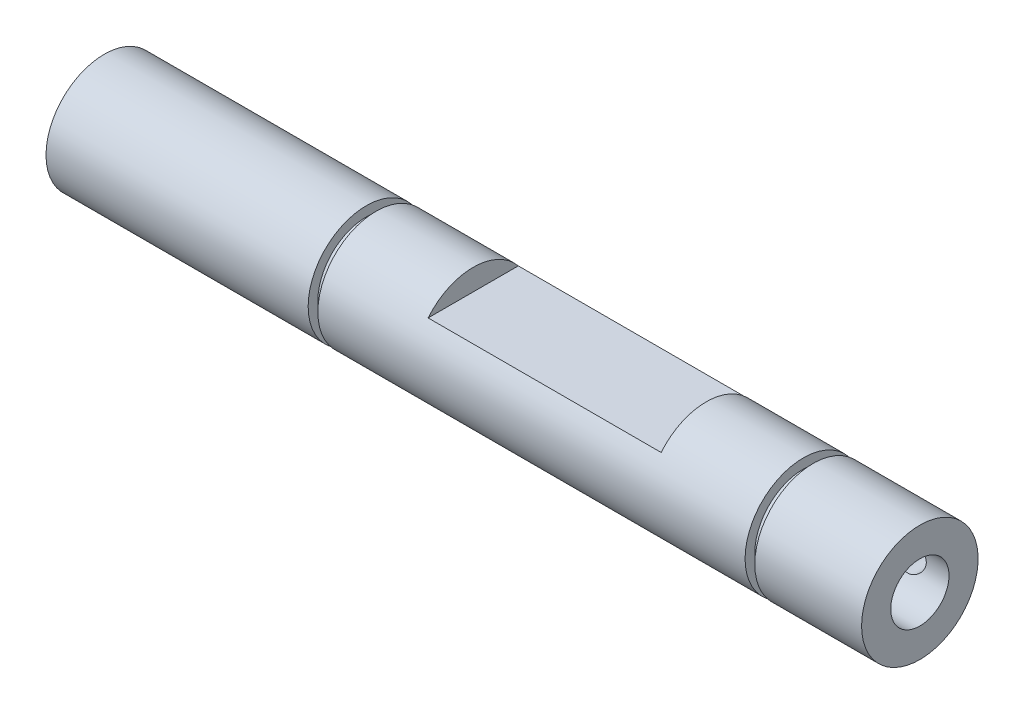
ISO-10303-21;
HEADER;
FILE_DESCRIPTION(('STEP AP214'),'2;1');
FILE_NAME('part.step','',(''),(''),'','','');
FILE_SCHEMA(('AUTOMOTIVE_DESIGN { 1 0 10303 214 1 1 1 1 }'));
ENDSEC;
DATA;
#1=APPLICATION_CONTEXT('core data for automotive mechanical design processes');
#2=APPLICATION_PROTOCOL_DEFINITION('international standard','automotive_design',2000,#1);
#3=PRODUCT_CONTEXT('',#1,'mechanical');
#4=PRODUCT('Part','Part','',(#3));
#5=PRODUCT_RELATED_PRODUCT_CATEGORY('part','',(#4));
#6=PRODUCT_DEFINITION_FORMATION('','',#4);
#7=PRODUCT_DEFINITION_CONTEXT('part definition',#1,'design');
#8=PRODUCT_DEFINITION('design','',#6,#7);
#9=PRODUCT_DEFINITION_SHAPE('','',#8);
#10=(LENGTH_UNIT() NAMED_UNIT(*) SI_UNIT(.MILLI.,.METRE.));
#11=(NAMED_UNIT(*) PLANE_ANGLE_UNIT() SI_UNIT($,.RADIAN.));
#12=(NAMED_UNIT(*) SI_UNIT($,.STERADIAN.) SOLID_ANGLE_UNIT());
#13=UNCERTAINTY_MEASURE_WITH_UNIT(LENGTH_MEASURE(1.E-05),#10,'distance_accuracy_value','');
#14=(GEOMETRIC_REPRESENTATION_CONTEXT(3) GLOBAL_UNCERTAINTY_ASSIGNED_CONTEXT((#13)) GLOBAL_UNIT_ASSIGNED_CONTEXT((#10,
#11,#12)) REPRESENTATION_CONTEXT('',''));
#15=CARTESIAN_POINT('',(0.,0.,0.));
#16=DIRECTION('',(0.,0.,1.));
#17=DIRECTION('',(1.,0.,0.));
#18=AXIS2_PLACEMENT_3D('',#15,#16,#17);
#19=CARTESIAN_POINT('',(-45.9333625661085,0.,0.));
#20=DIRECTION('',(1.,0.,0.));
#21=DIRECTION('',(0.,0.,-1.));
#22=AXIS2_PLACEMENT_3D('',#19,#20,#21);
#23=PLANE('',#22);
#24=CARTESIAN_POINT('',(-45.9333625661085,0.,0.));
#25=DIRECTION('',(-1.,0.,0.));
#26=DIRECTION('',(0.,0.,1.));
#27=AXIS2_PLACEMENT_3D('',#24,#25,#26);
#28=CIRCLE('',#27,6.);
#29=CARTESIAN_POINT('',(-45.9333625661085,0.,6.));
#30=VERTEX_POINT('',#29);
#31=EDGE_CURVE('E11',#30,#30,#28,.T.);
#32=ORIENTED_EDGE('',*,*,#31,.T.);
#33=EDGE_LOOP('',(#32));
#34=FACE_BOUND('',#33,.T.);
#35=ADVANCED_FACE('F36',(#34),#23,.F.);
#36=CARTESIAN_POINT('',(-45.9333625661085,0.,0.));
#37=DIRECTION('',(-1.,0.,0.));
#38=DIRECTION('',(0.,0.,1.));
#39=AXIS2_PLACEMENT_3D('',#36,#37,#38);
#40=CYLINDRICAL_SURFACE('',#39,6.);
#41=ORIENTED_EDGE('',*,*,#31,.F.);
#42=EDGE_LOOP('',(#41));
#43=FACE_BOUND('',#42,.T.);
#44=CARTESIAN_POINT('',(-18.9333625661084,0.,0.));
#45=DIRECTION('',(-1.,0.,0.));
#46=DIRECTION('',(0.,0.,1.));
#47=AXIS2_PLACEMENT_3D('',#44,#45,#46);
#48=CIRCLE('',#47,6.);
#49=CARTESIAN_POINT('',(-18.9333625661084,0.,6.));
#50=VERTEX_POINT('',#49);
#51=EDGE_CURVE('E49',#50,#50,#48,.T.);
#52=ORIENTED_EDGE('',*,*,#51,.T.);
#53=EDGE_LOOP('',(#52));
#54=FACE_BOUND('',#53,.T.);
#55=ADVANCED_FACE('F128',(#43,#54),#40,.T.);
#56=CARTESIAN_POINT('',(-18.9333625661084,6.,0.));
#57=DIRECTION('',(-1.,0.,0.));
#58=DIRECTION('',(0.,0.,1.));
#59=AXIS2_PLACEMENT_3D('',#56,#57,#58);
#60=PLANE('',#59);
#61=ORIENTED_EDGE('',*,*,#51,.F.);
#62=EDGE_LOOP('',(#61));
#63=FACE_BOUND('',#62,.T.);
#64=CARTESIAN_POINT('',(-18.9333625661084,0.,0.));
#65=DIRECTION('',(-1.,0.,0.));
#66=DIRECTION('',(0.,0.,1.));
#67=AXIS2_PLACEMENT_3D('',#64,#65,#66);
#68=CIRCLE('',#67,5.);
#69=CARTESIAN_POINT('',(-18.9333625661084,0.,5.));
#70=VERTEX_POINT('',#69);
#71=EDGE_CURVE('E140',#70,#70,#68,.T.);
#72=ORIENTED_EDGE('',*,*,#71,.T.);
#73=EDGE_LOOP('',(#72));
#74=FACE_BOUND('',#73,.T.);
#75=ADVANCED_FACE('F133',(#63,#74),#60,.F.);
#76=CARTESIAN_POINT('',(-45.9333625661085,0.,0.));
#77=DIRECTION('',(-1.,0.,0.));
#78=DIRECTION('',(0.,0.,1.));
#79=AXIS2_PLACEMENT_3D('',#76,#77,#78);
#80=CYLINDRICAL_SURFACE('',#79,5.);
#81=ORIENTED_EDGE('',*,*,#71,.F.);
#82=EDGE_LOOP('',(#81));
#83=FACE_BOUND('',#82,.T.);
#84=CARTESIAN_POINT('',(-17.9333625661084,0.,0.));
#85=DIRECTION('',(-1.,0.,0.));
#86=DIRECTION('',(0.,0.,1.));
#87=AXIS2_PLACEMENT_3D('',#84,#85,#86);
#88=CIRCLE('',#87,5.);
#89=CARTESIAN_POINT('',(-17.9333625661084,0.,5.));
#90=VERTEX_POINT('',#89);
#91=EDGE_CURVE('E143',#90,#90,#88,.T.);
#92=ORIENTED_EDGE('',*,*,#91,.T.);
#93=EDGE_LOOP('',(#92));
#94=FACE_BOUND('',#93,.T.);
#95=ADVANCED_FACE('F194',(#83,#94),#80,.T.);
#96=CARTESIAN_POINT('',(-17.9333625661084,6.,0.));
#97=DIRECTION('',(1.,0.,0.));
#98=DIRECTION('',(0.,0.,-1.));
#99=AXIS2_PLACEMENT_3D('',#96,#97,#98);
#100=PLANE('',#99);
#101=ORIENTED_EDGE('',*,*,#91,.F.);
#102=EDGE_LOOP('',(#101));
#103=FACE_BOUND('',#102,.T.);
#104=CARTESIAN_POINT('',(-17.9333625661084,0.,0.));
#105=DIRECTION('',(-1.,0.,0.));
#106=DIRECTION('',(0.,0.,1.));
#107=AXIS2_PLACEMENT_3D('',#104,#105,#106);
#108=CIRCLE('',#107,6.);
#109=CARTESIAN_POINT('',(-17.9333625661084,0.,6.));
#110=VERTEX_POINT('',#109);
#111=EDGE_CURVE('E148',#110,#110,#108,.T.);
#112=ORIENTED_EDGE('',*,*,#111,.T.);
#113=EDGE_LOOP('',(#112));
#114=FACE_BOUND('',#113,.T.);
#115=ADVANCED_FACE('F191',(#103,#114),#100,.F.);
#116=CARTESIAN_POINT('',(-45.9333625661085,0.,0.));
#117=DIRECTION('',(-1.,0.,0.));
#118=DIRECTION('',(0.,0.,1.));
#119=AXIS2_PLACEMENT_3D('',#116,#117,#118);
#120=CYLINDRICAL_SURFACE('',#119,6.);
#121=DIRECTION('',(-1.,0.,0.));
#122=VECTOR('',#121,1.);
#123=CARTESIAN_POINT('',(-45.9333625661085,3.8,-4.64327470649756));
#124=LINE('',#123,#122);
#125=CARTESIAN_POINT('',(-7.93336256610846,3.8,-4.64327470649756));
#126=VERTEX_POINT('',#125);
#127=CARTESIAN_POINT('',(16.0666374338915,3.8,-4.64327470649756));
#128=VERTEX_POINT('',#127);
#129=EDGE_CURVE('E78',#126,#128,#124,.F.);
#130=ORIENTED_EDGE('',*,*,#129,.T.);
#131=CARTESIAN_POINT('',(16.0666374338915,0.,0.));
#132=DIRECTION('',(1.,0.,0.));
#133=DIRECTION('',(0.,0.,-1.));
#134=AXIS2_PLACEMENT_3D('',#131,#132,#133);
#135=CIRCLE('',#134,6.);
#136=CARTESIAN_POINT('',(16.0666374338915,3.8,4.64327470649756));
#137=VERTEX_POINT('',#136);
#138=EDGE_CURVE('E61',#128,#137,#135,.T.);
#139=ORIENTED_EDGE('',*,*,#138,.T.);
#140=DIRECTION('',(-1.,0.,0.));
#141=VECTOR('',#140,1.);
#142=CARTESIAN_POINT('',(-45.9333625661085,3.8,4.64327470649756));
#143=LINE('',#142,#141);
#144=CARTESIAN_POINT('',(-7.93336256610846,3.8,4.64327470649756));
#145=VERTEX_POINT('',#144);
#146=EDGE_CURVE('E76',#137,#145,#143,.T.);
#147=ORIENTED_EDGE('',*,*,#146,.T.);
#148=CARTESIAN_POINT('',(-7.93336256610846,0.,0.));
#149=DIRECTION('',(-1.,0.,0.));
#150=DIRECTION('',(0.,0.,1.));
#151=AXIS2_PLACEMENT_3D('',#148,#149,#150);
#152=CIRCLE('',#151,6.);
#153=EDGE_CURVE('E56',#145,#126,#152,.T.);
#154=ORIENTED_EDGE('',*,*,#153,.T.);
#155=EDGE_LOOP('',(#130,#139,#147,#154));
#156=FACE_BOUND('',#155,.T.);
#157=ORIENTED_EDGE('',*,*,#111,.F.);
#158=EDGE_LOOP('',(#157));
#159=FACE_BOUND('',#158,.T.);
#160=CARTESIAN_POINT('',(26.0666374338916,0.,0.));
#161=DIRECTION('',(-1.,0.,0.));
#162=DIRECTION('',(0.,0.,1.));
#163=AXIS2_PLACEMENT_3D('',#160,#161,#162);
#164=CIRCLE('',#163,6.);
#165=CARTESIAN_POINT('',(26.0666374338916,0.,6.));
#166=VERTEX_POINT('',#165);
#167=EDGE_CURVE('E151',#166,#166,#164,.T.);
#168=ORIENTED_EDGE('',*,*,#167,.T.);
#169=EDGE_LOOP('',(#168));
#170=FACE_BOUND('',#169,.T.);
#171=ADVANCED_FACE('F80',(#156,#159,#170),#120,.T.);
#172=CARTESIAN_POINT('',(26.0666374338915,6.,0.));
#173=DIRECTION('',(-1.,0.,0.));
#174=DIRECTION('',(0.,0.,1.));
#175=AXIS2_PLACEMENT_3D('',#172,#173,#174);
#176=PLANE('',#175);
#177=ORIENTED_EDGE('',*,*,#167,.F.);
#178=EDGE_LOOP('',(#177));
#179=FACE_BOUND('',#178,.T.);
#180=CARTESIAN_POINT('',(26.0666374338916,0.,0.));
#181=DIRECTION('',(-1.,0.,0.));
#182=DIRECTION('',(0.,0.,1.));
#183=AXIS2_PLACEMENT_3D('',#180,#181,#182);
#184=CIRCLE('',#183,5.);
#185=CARTESIAN_POINT('',(26.0666374338916,0.,5.));
#186=VERTEX_POINT('',#185);
#187=EDGE_CURVE('E154',#186,#186,#184,.T.);
#188=ORIENTED_EDGE('',*,*,#187,.T.);
#189=EDGE_LOOP('',(#188));
#190=FACE_BOUND('',#189,.T.);
#191=ADVANCED_FACE('F181',(#179,#190),#176,.F.);
#192=CARTESIAN_POINT('',(-45.9333625661085,0.,0.));
#193=DIRECTION('',(-1.,0.,0.));
#194=DIRECTION('',(0.,0.,1.));
#195=AXIS2_PLACEMENT_3D('',#192,#193,#194);
#196=CYLINDRICAL_SURFACE('',#195,5.);
#197=ORIENTED_EDGE('',*,*,#187,.F.);
#198=EDGE_LOOP('',(#197));
#199=FACE_BOUND('',#198,.T.);
#200=CARTESIAN_POINT('',(27.0666374338916,0.,0.));
#201=DIRECTION('',(-1.,0.,0.));
#202=DIRECTION('',(0.,0.,1.));
#203=AXIS2_PLACEMENT_3D('',#200,#201,#202);
#204=CIRCLE('',#203,5.);
#205=CARTESIAN_POINT('',(27.0666374338916,0.,5.));
#206=VERTEX_POINT('',#205);
#207=EDGE_CURVE('E157',#206,#206,#204,.T.);
#208=ORIENTED_EDGE('',*,*,#207,.T.);
#209=EDGE_LOOP('',(#208));
#210=FACE_BOUND('',#209,.T.);
#211=ADVANCED_FACE('F176',(#199,#210),#196,.T.);
#212=CARTESIAN_POINT('',(27.0666374338916,6.,0.));
#213=DIRECTION('',(1.,0.,0.));
#214=DIRECTION('',(0.,0.,-1.));
#215=AXIS2_PLACEMENT_3D('',#212,#213,#214);
#216=PLANE('',#215);
#217=ORIENTED_EDGE('',*,*,#207,.F.);
#218=EDGE_LOOP('',(#217));
#219=FACE_BOUND('',#218,.T.);
#220=CARTESIAN_POINT('',(27.0666374338916,0.,0.));
#221=DIRECTION('',(-1.,0.,0.));
#222=DIRECTION('',(0.,0.,1.));
#223=AXIS2_PLACEMENT_3D('',#220,#221,#222);
#224=CIRCLE('',#223,6.);
#225=CARTESIAN_POINT('',(27.0666374338916,0.,6.));
#226=VERTEX_POINT('',#225);
#227=EDGE_CURVE('E160',#226,#226,#224,.T.);
#228=ORIENTED_EDGE('',*,*,#227,.T.);
#229=EDGE_LOOP('',(#228));
#230=FACE_BOUND('',#229,.T.);
#231=ADVANCED_FACE('F123',(#219,#230),#216,.F.);
#232=CARTESIAN_POINT('',(-45.9333625661085,0.,0.));
#233=DIRECTION('',(-1.,0.,0.));
#234=DIRECTION('',(0.,0.,1.));
#235=AXIS2_PLACEMENT_3D('',#232,#233,#234);
#236=CYLINDRICAL_SURFACE('',#235,6.);
#237=CARTESIAN_POINT('',(35.7311495764186,0.,-6.));
#238=CARTESIAN_POINT('',(35.7311472506804,0.0828760886697312,-5.99999859868013));
#239=CARTESIAN_POINT('',(35.7242580256448,0.165778157830763,-5.99826578131828));
#240=CARTESIAN_POINT('',(35.6969244251116,0.329206323770533,-5.99152113829892));
#241=CARTESIAN_POINT('',(35.6764723668808,0.40973104687074,-5.98650745419968));
#242=CARTESIAN_POINT('',(35.6227103229565,0.566020872182578,-5.9737562633204));
#243=CARTESIAN_POINT('',(35.5894157777033,0.641791563430004,-5.96602202842087));
#244=CARTESIAN_POINT('',(35.5109681863738,0.786672131904429,-5.94865343807593));
#245=CARTESIAN_POINT('',(35.4658147402997,0.855781784348762,-5.9390190185405));
#246=CARTESIAN_POINT('',(35.3639487867644,0.986801927300924,-5.91867413591801));
#247=CARTESIAN_POINT('',(35.3070380014594,1.04855569006108,-5.90794707148533));
#248=CARTESIAN_POINT('',(35.1836973715097,1.16174892720331,-5.88673620117529));
#249=CARTESIAN_POINT('',(35.1172664534721,1.21318723694914,-5.87625242288348));
#250=CARTESIAN_POINT('',(34.9755543496812,1.30502654279904,-5.8565477569971));
#251=CARTESIAN_POINT('',(34.9001563456082,1.34525221592536,-5.84734794470605));
#252=CARTESIAN_POINT('',(34.7434011647602,1.41239690855053,-5.83149494812223));
#253=CARTESIAN_POINT('',(34.6620449430928,1.43931805543934,-5.82484135672789));
#254=CARTESIAN_POINT('',(34.4974060782161,1.47855483680429,-5.81500476717551));
#255=CARTESIAN_POINT('',(34.4141946803688,1.49115226833334,-5.81175491075426));
#256=CARTESIAN_POINT('',(34.2467810074046,1.50226177506786,-5.80889362537741));
#257=CARTESIAN_POINT('',(34.16257889572,1.50077614181798,-5.80928160448644));
#258=CARTESIAN_POINT('',(33.9977337686741,1.48398652463928,-5.81359205496618));
#259=CARTESIAN_POINT('',(33.9170539549535,1.46901834019052,-5.81742863001879));
#260=CARTESIAN_POINT('',(33.7593885255073,1.42622418690311,-5.82806709676483));
#261=CARTESIAN_POINT('',(33.6824031733896,1.39839730206943,-5.83486919970696));
#262=CARTESIAN_POINT('',(33.5334115601665,1.33038947793716,-5.85075113904186));
#263=CARTESIAN_POINT('',(33.4614634046291,1.29008666723292,-5.85985327469421));
#264=CARTESIAN_POINT('',(33.3252308666618,1.19835627601496,-5.87929710846386));
#265=CARTESIAN_POINT('',(33.2609478283513,1.14692674880884,-5.88963902334735));
#266=CARTESIAN_POINT('',(33.1399459607242,1.03266342468122,-5.91075880539781));
#267=CARTESIAN_POINT('',(33.0834950863572,0.969546258165863,-5.92154069477971));
#268=CARTESIAN_POINT('',(32.9819283339547,0.834611917503705,-5.94205965578786));
#269=CARTESIAN_POINT('',(32.936812802155,0.76279447770795,-5.95179669549415));
#270=CARTESIAN_POINT('',(32.8590989901942,0.612115888681399,-5.96917732094182));
#271=CARTESIAN_POINT('',(32.8265442361642,0.53323139320863,-5.97681360127725));
#272=CARTESIAN_POINT('',(32.775232270709,0.370876008142887,-5.98907916991418));
#273=CARTESIAN_POINT('',(32.7564724200005,0.287405999150488,-5.99370903339281));
#274=CARTESIAN_POINT('',(32.7336920108598,0.120539970390028,-5.99935499271375));
#275=CARTESIAN_POINT('',(32.7293065503433,0.0371967199882103,-6.00046053508279));
#276=CARTESIAN_POINT('',(32.7343985784741,-0.129032874801508,-5.99918804814451));
#277=CARTESIAN_POINT('',(32.7438748192177,-0.211919259644595,-5.99681033241846));
#278=CARTESIAN_POINT('',(32.77612048481,-0.373614268776492,-5.98889581127357));
#279=CARTESIAN_POINT('',(32.7986908398956,-0.452465118968755,-5.98340634185811));
#280=CARTESIAN_POINT('',(32.856256660447,-0.605257292452512,-5.96988706634134));
#281=CARTESIAN_POINT('',(32.8912533807318,-0.679198119032635,-5.96185700369892));
#282=CARTESIAN_POINT('',(32.9733857052933,-0.821523134429848,-5.9439330792631));
#283=CARTESIAN_POINT('',(33.0207256888154,-0.889785441835831,-5.93400867366932));
#284=CARTESIAN_POINT('',(33.1259394852156,-1.01752661364325,-5.91344509187419));
#285=CARTESIAN_POINT('',(33.1838151160355,-1.07700395897301,-5.90280579251705));
#286=CARTESIAN_POINT('',(33.3101515372631,-1.18699056807273,-5.88168956960771));
#287=CARTESIAN_POINT('',(33.378837279421,-1.23724386762204,-5.87122304187281));
#288=CARTESIAN_POINT('',(33.5238822108843,-1.3255107590127,-5.85192878377239));
#289=CARTESIAN_POINT('',(33.6002410593783,-1.36352489415794,-5.84310098067026));
#290=CARTESIAN_POINT('',(33.7580552988317,-1.4259514206093,-5.82818094734665));
#291=CARTESIAN_POINT('',(33.8394772047626,-1.45044439665407,-5.82207255291905));
#292=CARTESIAN_POINT('',(34.0054592143077,-1.48534565995378,-5.81326744090183));
#293=CARTESIAN_POINT('',(34.0900186274511,-1.49575702747866,-5.81056997719936));
#294=CARTESIAN_POINT('',(34.2572706002738,-1.502038590334,-5.80894901203957));
#295=CARTESIAN_POINT('',(34.3399470115433,-1.49831789778012,-5.80991932728264));
#296=CARTESIAN_POINT('',(34.5034534650866,-1.47737727831287,-5.81527909007843));
#297=CARTESIAN_POINT('',(34.5842835444322,-1.46015762268677,-5.81966846891857));
#298=CARTESIAN_POINT('',(34.741358035484,-1.4129313194428,-5.83131260682722));
#299=CARTESIAN_POINT('',(34.8176268816588,-1.38300140468038,-5.83855015236309));
#300=CARTESIAN_POINT('',(34.9641149591323,-1.31126491360508,-5.85507755724828));
#301=CARTESIAN_POINT('',(35.0343333496055,-1.26945669003419,-5.86436770120773));
#302=CARTESIAN_POINT('',(35.1687042054206,-1.17386774863714,-5.88425634263512));
#303=CARTESIAN_POINT('',(35.2326506498426,-1.11980316291226,-5.89488264831757));
#304=CARTESIAN_POINT('',(35.350696621214,-1.00178937118974,-5.91608027246286));
#305=CARTESIAN_POINT('',(35.4047938065316,-0.937837821261148,-5.92665157727059));
#306=CARTESIAN_POINT('',(35.5025608849832,-0.800467586702591,-5.94677655647663));
#307=CARTESIAN_POINT('',(35.5460241900902,-0.726898422316387,-5.95630833365868));
#308=CARTESIAN_POINT('',(35.6198970393591,-0.573266059510477,-5.97304924975118));
#309=CARTESIAN_POINT('',(35.6503159370671,-0.493207563436742,-5.98026005199781));
#310=CARTESIAN_POINT('',(35.6927214067483,-0.344410253243473,-5.99048059565542));
#311=CARTESIAN_POINT('',(35.707100819472,-0.276380170908069,-5.99402585052691));
#312=CARTESIAN_POINT('',(35.7263155200405,-0.138906071536283,-5.99878605231948));
#313=CARTESIAN_POINT('',(35.7311515257239,-0.0694621612426162,-6.00000117450894));
#314=CARTESIAN_POINT('',(35.7311495764186,0.,-6.));
#315=B_SPLINE_CURVE_WITH_KNOTS('',3,(#237,#238,#239,#240,#241,#242,#243,#244,#245,#246,#247,
#248,#249,#250,#251,#252,#253,#254,#255,#256,#257,#258,#259,#260,#261,#262,#263,#264,#265,#266,
#267,#268,#269,#270,#271,#272,#273,#274,#275,#276,#277,#278,#279,#280,#281,#282,#283,#284,#285,
#286,#287,#288,#289,#290,#291,#292,#293,#294,#295,#296,#297,#298,#299,#300,#301,#302,#303,#304,
#305,#306,#307,#308,#309,#310,#311,#312,#313,#314),.UNSPECIFIED.,.T.,.F.,(4,2,2,2,2,2,2,2,2,2,2,
2,2,2,2,2,2,2,2,2,2,2,2,2,2,2,2,2,2,2,2,2,2,2,2,2,2,2,4),(0.,0.24837371247189,0.496888237763901,
0.745104902286107,0.99332994016933,1.24614435437139,1.49898729580062,1.75558647545807,
2.01214461169369,2.2635629509943,2.51494038112697,2.76022497007018,3.00552703466039,
3.25330527873879,3.50112690836164,3.7560150096902,4.01091089558247,4.26668229009115,
4.52240473688644,4.77158308949277,5.02073901112744,5.26620274514038,5.51169127322292,
5.76153587565353,6.0114236300802,6.26744509204477,6.5234551874951,6.77792254614039,
7.0323342325241,7.27943780398614,7.52653640956036,7.77216400559449,8.01782568136903,
8.26989576409912,8.5220256977042,8.7787218549959,9.03523363821352,9.24342242942151,
9.45159556043042),.UNSPECIFIED.);
#316=CARTESIAN_POINT('',(35.7311495764186,0.,-6.));
#317=VERTEX_POINT('',#316);
#318=EDGE_CURVE('E84',#317,#317,#315,.T.);
#319=ORIENTED_EDGE('',*,*,#318,.T.);
#320=EDGE_LOOP('',(#319));
#321=FACE_BOUND('',#320,.T.);
#322=ORIENTED_EDGE('',*,*,#227,.F.);
#323=EDGE_LOOP('',(#322));
#324=FACE_BOUND('',#323,.T.);
#325=CARTESIAN_POINT('',(38.0666374338916,0.,0.));
#326=DIRECTION('',(-1.,0.,0.));
#327=DIRECTION('',(0.,0.,1.));
#328=AXIS2_PLACEMENT_3D('',#325,#326,#327);
#329=CIRCLE('',#328,6.);
#330=CARTESIAN_POINT('',(38.0666374338916,0.,6.));
#331=VERTEX_POINT('',#330);
#332=EDGE_CURVE('E163',#331,#331,#329,.T.);
#333=ORIENTED_EDGE('',*,*,#332,.T.);
#334=EDGE_LOOP('',(#333));
#335=FACE_BOUND('',#334,.T.);
#336=ADVANCED_FACE('F97',(#321,#324,#335),#236,.T.);
#337=CARTESIAN_POINT('',(38.0666374338916,0.,0.));
#338=DIRECTION('',(-1.,0.,0.));
#339=DIRECTION('',(0.,0.,1.));
#340=AXIS2_PLACEMENT_3D('',#337,#338,#339);
#341=PLANE('',#340);
#342=CARTESIAN_POINT('',(38.0666374338916,0.,0.));
#343=DIRECTION('',(1.,0.,0.));
#344=DIRECTION('',(0.,0.,-1.));
#345=AXIS2_PLACEMENT_3D('',#342,#343,#344);
#346=CIRCLE('',#345,3.);
#347=CARTESIAN_POINT('',(38.0666374338916,0.,-3.));
#348=VERTEX_POINT('',#347);
#349=EDGE_CURVE('E94',#348,#348,#346,.T.);
#350=ORIENTED_EDGE('',*,*,#349,.F.);
#351=EDGE_LOOP('',(#350));
#352=FACE_BOUND('',#351,.T.);
#353=ORIENTED_EDGE('',*,*,#332,.F.);
#354=EDGE_LOOP('',(#353));
#355=FACE_BOUND('',#354,.T.);
#356=ADVANCED_FACE('F116',(#352,#355),#341,.F.);
#357=CARTESIAN_POINT('',(28.0666374338915,0.,0.));
#358=DIRECTION('',(1.,0.,0.));
#359=DIRECTION('',(0.,0.,-1.));
#360=AXIS2_PLACEMENT_3D('',#357,#358,#359);
#361=CYLINDRICAL_SURFACE('',#360,3.);
#362=CARTESIAN_POINT('',(32.7311495764186,0.,-3.));
#363=CARTESIAN_POINT('',(32.7311545298944,0.0788579444268505,-2.99999570107562));
#364=CARTESIAN_POINT('',(32.7374046861002,0.157809899546344,-2.99685736529635));
#365=CARTESIAN_POINT('',(32.7621288969309,0.313380352903345,-2.98461234055736));
#366=CARTESIAN_POINT('',(32.7806261659153,0.389994130070445,-2.97549431743379));
#367=CARTESIAN_POINT('',(32.8289402893435,0.538400317320674,-2.95224419105063));
#368=CARTESIAN_POINT('',(32.8587131527905,0.610210204408719,-2.93813158766306));
#369=CARTESIAN_POINT('',(32.9285055084661,0.747708925209898,-2.90618664773642));
#370=CARTESIAN_POINT('',(32.9685241927919,0.81339824098509,-2.88835460450288));
#371=CARTESIAN_POINT('',(33.0604254506465,0.941261726642864,-2.84934387387093));
#372=CARTESIAN_POINT('',(33.112879295278,1.00298281668316,-2.82802798691306));
#373=CARTESIAN_POINT('',(33.2269317952891,1.11716916730047,-2.78489955370115));
#374=CARTESIAN_POINT('',(33.2885373540773,1.16962737466015,-2.76308664313552));
#375=CARTESIAN_POINT('',(33.4248746007037,1.26787800067542,-2.71948426796021));
#376=CARTESIAN_POINT('',(33.5002537239375,1.31283800332746,-2.69782780455198));
#377=CARTESIAN_POINT('',(33.6587005803979,1.38925234033605,-2.65928968158481));
#378=CARTESIAN_POINT('',(33.7417627695027,1.4207163224495,-2.64240461410484));
#379=CARTESIAN_POINT('',(33.9081472345515,1.46719866328289,-2.61686800556713));
#380=CARTESIAN_POINT('',(33.9911562545197,1.48308878562067,-2.6077840737557));
#381=CARTESIAN_POINT('',(34.1591178330878,1.50064048996327,-2.59772834922791));
#382=CARTESIAN_POINT('',(34.2440683877253,1.50231613255961,-2.59674854014932));
#383=CARTESIAN_POINT('',(34.4025786128916,1.49203093075845,-2.60266395385873));
#384=CARTESIAN_POINT('',(34.4762856232532,1.48167683930524,-2.6086314549302));
#385=CARTESIAN_POINT('',(34.6207324404782,1.4504097735854,-2.62614343100775));
#386=CARTESIAN_POINT('',(34.6914712943766,1.42949343584648,-2.63768968247664));
#387=CARTESIAN_POINT('',(34.8299932752671,1.37731467057901,-2.66531214619111));
#388=CARTESIAN_POINT('',(34.8976691745973,1.345822600674,-2.68148760995998));
#389=CARTESIAN_POINT('',(35.0271010153036,1.27356253150201,-2.71655106422105));
#390=CARTESIAN_POINT('',(35.0888542798187,1.23279036571871,-2.73544027170285));
#391=CARTESIAN_POINT('',(35.2129314555334,1.13709908236919,-2.77669736854928));
#392=CARTESIAN_POINT('',(35.2743348867828,1.08104168755393,-2.79920265355119));
#393=CARTESIAN_POINT('',(35.3872527043049,0.959333368112068,-2.84321434950611));
#394=CARTESIAN_POINT('',(35.4387623644694,0.893677884861435,-2.86472027938201));
#395=CARTESIAN_POINT('',(35.5326780679632,0.750774758747778,-2.90552980924446));
#396=CARTESIAN_POINT('',(35.5745502850872,0.673130387399117,-2.92468476243011));
#397=CARTESIAN_POINT('',(35.6442951199831,0.510699323233196,-2.95736821681863));
#398=CARTESIAN_POINT('',(35.6721788539413,0.425918364397915,-2.9709011841533));
#399=CARTESIAN_POINT('',(35.7108626819936,0.259149737491054,-2.98986500612153));
#400=CARTESIAN_POINT('',(35.7228864300388,0.17751229582249,-2.99587407451965));
#401=CARTESIAN_POINT('',(35.7333466731203,0.0131693999240292,-3.00109520188655));
#402=CARTESIAN_POINT('',(35.7317896048778,-0.0695355298048607,-3.00031048081978));
#403=CARTESIAN_POINT('',(35.7158395437905,-0.226849457978979,-2.99236788380152));
#404=CARTESIAN_POINT('',(35.7024507773236,-0.301589112074895,-2.98570868532252));
#405=CARTESIAN_POINT('',(35.6647924685759,-0.447610338452912,-2.9673325697226));
#406=CARTESIAN_POINT('',(35.6405217267384,-0.518891528536631,-2.95561509501618));
#407=CARTESIAN_POINT('',(35.581151876769,-0.658332912674361,-2.92776377120382));
#408=CARTESIAN_POINT('',(35.5457630012442,-0.726345595508709,-2.91151322654446));
#409=CARTESIAN_POINT('',(35.4654882729487,-0.855692042548911,-2.87615961476126));
#410=CARTESIAN_POINT('',(35.4205983745255,-0.917022944664889,-2.85705533350407));
#411=CARTESIAN_POINT('',(35.3175089384225,-1.03765153393382,-2.81562332004297));
#412=CARTESIAN_POINT('',(35.2584352737509,-1.09615811672854,-2.79316327265249));
#413=CARTESIAN_POINT('',(35.131261849502,-1.20278448167829,-2.7489358741323));
#414=CARTESIAN_POINT('',(35.0631558981467,-1.25089707856781,-2.72716901100071));
#415=CARTESIAN_POINT('',(34.9156840951591,-1.33756187171853,-2.68576788309734));
#416=CARTESIAN_POINT('',(34.8359326772769,-1.37553824370037,-2.66628794383591));
#417=CARTESIAN_POINT('',(34.6698844750562,-1.43712423890206,-2.63361108441202));
#418=CARTESIAN_POINT('',(34.5835962867183,-1.46075237380053,-2.62040607332625));
#419=CARTESIAN_POINT('',(34.4157842420915,-1.49079253120031,-2.60342251538703));
#420=CARTESIAN_POINT('',(34.3345981962657,-1.49863949460818,-2.59886075197597));
#421=CARTESIAN_POINT('',(34.1719789756718,-1.50103373156431,-2.59748031962405));
#422=CARTESIAN_POINT('',(34.0905459233118,-1.49558676993487,-2.60065829439585));
#423=CARTESIAN_POINT('',(33.9379243241184,-1.47288918838997,-2.61356793076615));
#424=CARTESIAN_POINT('',(33.8664988712015,-1.45681247151455,-2.62264641723987));
#425=CARTESIAN_POINT('',(33.727437397282,-1.41476303733662,-2.64556524281479));
#426=CARTESIAN_POINT('',(33.6598026032805,-1.38878713673989,-2.65940711354503));
#427=CARTESIAN_POINT('',(33.5252122999388,-1.32572361795085,-2.69142795546803));
#428=CARTESIAN_POINT('',(33.458607723675,-1.28800670672355,-2.70983583593881));
#429=CARTESIAN_POINT('',(33.3322377721467,-1.20322645745609,-2.7485299745229));
#430=CARTESIAN_POINT('',(33.2724759806369,-1.15615825686235,-2.76881720693416));
#431=CARTESIAN_POINT('',(33.1539366028866,-1.04730498999207,-2.81193484737138));
#432=CARTESIAN_POINT('',(33.0961609228932,-0.984426634495899,-2.83477474959942));
#433=CARTESIAN_POINT('',(32.9917551012657,-0.849232209349803,-2.87816628389896));
#434=CARTESIAN_POINT('',(32.9451309672137,-0.776911084957804,-2.89871667939292));
#435=CARTESIAN_POINT('',(32.8642950323505,-0.623897395174428,-2.93547014349806));
#436=CARTESIAN_POINT('',(32.8301733225639,-0.543149255665105,-2.95164144740899));
#437=CARTESIAN_POINT('',(32.7764373247825,-0.376113151707137,-2.9775201194848));
#438=CARTESIAN_POINT('',(32.75678180621,-0.289841699383655,-2.98724585044602));
#439=CARTESIAN_POINT('',(32.74030345979,-0.168902919736347,-2.99543192870217));
#440=CARTESIAN_POINT('',(32.7368756151191,-0.135242819162351,-2.99714048010376));
#441=CARTESIAN_POINT('',(32.7322975781475,-0.0677275977076394,-2.99942545465223));
#442=CARTESIAN_POINT('',(32.7311474487133,-0.0338724714699437,-3.00000184655071));
#443=CARTESIAN_POINT('',(32.7311495764186,0.,-3.));
#444=B_SPLINE_CURVE_WITH_KNOTS('',3,(#362,#363,#364,#365,#366,#367,#368,#369,#370,#371,#372,
#373,#374,#375,#376,#377,#378,#379,#380,#381,#382,#383,#384,#385,#386,#387,#388,#389,#390,#391,
#392,#393,#394,#395,#396,#397,#398,#399,#400,#401,#402,#403,#404,#405,#406,#407,#408,#409,#410,
#411,#412,#413,#414,#415,#416,#417,#418,#419,#420,#421,#422,#423,#424,#425,#426,#427,#428,#429,
#430,#431,#432,#433,#434,#435,#436,#437,#438,#439,#440,#441,#442,#443),.UNSPECIFIED.,.T.,.F.,(4,
2,2,2,2,2,2,2,2,2,2,2,2,2,2,2,2,2,2,2,2,2,2,2,2,2,2,2,2,2,2,2,2,2,2,2,2,2,2,2,4),(0.,
0.236436386130439,0.473322224563797,0.709293233238445,0.945245640872351,1.19547263807713,
1.44588935648105,1.71572589646129,1.98536921847422,2.23887018210346,2.49212035993531,
2.71508568613981,2.93812205888519,3.16635360252731,3.39468781890333,3.65197412000818,
3.9093830189803,4.17874533321662,4.44789325368421,4.6947493570702,4.94148846767215,
5.16910359759184,5.39674382446398,5.6308928404185,5.86514176122511,6.1223941596663,
6.37982382923149,6.6497202324259,6.91926767918177,7.16293961254571,7.40650589797019,
7.62686895373286,7.84730293182529,8.08254685170433,8.31791341715448,8.58187864135759,
8.8459857507187,9.11196020495292,9.37717362931726,9.47872920200878,9.58028757766602),.UNSPECIFIED.);
#445=CARTESIAN_POINT('',(32.7311495764186,0.,-3.));
#446=VERTEX_POINT('',#445);
#447=EDGE_CURVE('E39',#446,#446,#444,.T.);
#448=ORIENTED_EDGE('',*,*,#447,.T.);
#449=EDGE_LOOP('',(#448));
#450=FACE_BOUND('',#449,.T.);
#451=CARTESIAN_POINT('',(28.0666374338915,0.,0.));
#452=DIRECTION('',(1.,0.,0.));
#453=DIRECTION('',(0.,0.,-1.));
#454=AXIS2_PLACEMENT_3D('',#451,#452,#453);
#455=CIRCLE('',#454,3.);
#456=CARTESIAN_POINT('',(28.0666374338915,0.,-3.));
#457=VERTEX_POINT('',#456);
#458=EDGE_CURVE('E95',#457,#457,#455,.T.);
#459=ORIENTED_EDGE('',*,*,#458,.F.);
#460=EDGE_LOOP('',(#459));
#461=FACE_BOUND('',#460,.T.);
#462=ORIENTED_EDGE('',*,*,#349,.T.);
#463=EDGE_LOOP('',(#462));
#464=FACE_BOUND('',#463,.T.);
#465=ADVANCED_FACE('F112',(#450,#461,#464),#361,.F.);
#466=CARTESIAN_POINT('',(28.0666374338915,0.,0.));
#467=DIRECTION('',(1.,0.,0.));
#468=DIRECTION('',(0.,0.,-1.));
#469=AXIS2_PLACEMENT_3D('',#466,#467,#468);
#470=PLANE('',#469);
#471=ORIENTED_EDGE('',*,*,#458,.T.);
#472=EDGE_LOOP('',(#471));
#473=FACE_BOUND('',#472,.T.);
#474=ADVANCED_FACE('F107',(#473),#470,.T.);
#475=CARTESIAN_POINT('',(34.2311495764186,0.,-10.));
#476=DIRECTION('',(0.,0.,1.));
#477=DIRECTION('',(1.,0.,0.));
#478=AXIS2_PLACEMENT_3D('',#475,#476,#477);
#479=CYLINDRICAL_SURFACE('',#478,1.5);
#480=ORIENTED_EDGE('',*,*,#447,.F.);
#481=EDGE_LOOP('',(#480));
#482=FACE_BOUND('',#481,.T.);
#483=ORIENTED_EDGE('',*,*,#318,.F.);
#484=EDGE_LOOP('',(#483));
#485=FACE_BOUND('',#484,.T.);
#486=ADVANCED_FACE('F101',(#482,#485),#479,.F.);
#487=CARTESIAN_POINT('',(16.0666374338915,3.8,-8.));
#488=DIRECTION('',(1.,0.,0.));
#489=DIRECTION('',(0.,0.,-1.));
#490=AXIS2_PLACEMENT_3D('',#487,#488,#489);
#491=PLANE('',#490);
#492=ORIENTED_EDGE('',*,*,#138,.F.);
#493=DIRECTION('',(0.,0.,1.));
#494=VECTOR('',#493,1.);
#495=CARTESIAN_POINT('',(16.0666374338915,3.8,-8.));
#496=LINE('',#495,#494);
#497=EDGE_CURVE('E72',#128,#137,#496,.T.);
#498=ORIENTED_EDGE('',*,*,#497,.T.);
#499=EDGE_LOOP('',(#492,#498));
#500=FACE_BOUND('',#499,.T.);
#501=ADVANCED_FACE('F106',(#500),#491,.F.);
#502=CARTESIAN_POINT('',(-7.93336256610846,3.8,-8.));
#503=DIRECTION('',(-1.,0.,0.));
#504=DIRECTION('',(0.,0.,1.));
#505=AXIS2_PLACEMENT_3D('',#502,#503,#504);
#506=PLANE('',#505);
#507=DIRECTION('',(0.,0.,1.));
#508=VECTOR('',#507,1.);
#509=CARTESIAN_POINT('',(-7.93336256610846,3.8,-8.));
#510=LINE('',#509,#508);
#511=EDGE_CURVE('E70',#126,#145,#510,.T.);
#512=ORIENTED_EDGE('',*,*,#511,.F.);
#513=ORIENTED_EDGE('',*,*,#153,.F.);
#514=EDGE_LOOP('',(#512,#513));
#515=FACE_BOUND('',#514,.T.);
#516=ADVANCED_FACE('F69',(#515),#506,.F.);
#517=CARTESIAN_POINT('',(-5.93336256610845,3.8,0.));
#518=DIRECTION('',(0.,1.,0.));
#519=DIRECTION('',(0.,0.,1.));
#520=AXIS2_PLACEMENT_3D('',#517,#518,#519);
#521=PLANE('',#520);
#522=ORIENTED_EDGE('',*,*,#129,.F.);
#523=ORIENTED_EDGE('',*,*,#511,.T.);
#524=ORIENTED_EDGE('',*,*,#146,.F.);
#525=ORIENTED_EDGE('',*,*,#497,.F.);
#526=EDGE_LOOP('',(#522,#523,#524,#525));
#527=FACE_BOUND('',#526,.T.);
#528=ADVANCED_FACE('F75',(#527),#521,.T.);
#529=CLOSED_SHELL('',(#35,#55,#75,#95,#115,#171,#191,#211,#231,#336,#356,#465,#474,#486,#501,
#516,#528));
#530=MANIFOLD_SOLID_BREP('B2',#529);
#531=ADVANCED_BREP_SHAPE_REPRESENTATION('',(#18,#530),#14);
#532=SHAPE_DEFINITION_REPRESENTATION(#9,#531);
ENDSEC;
END-ISO-10303-21;
